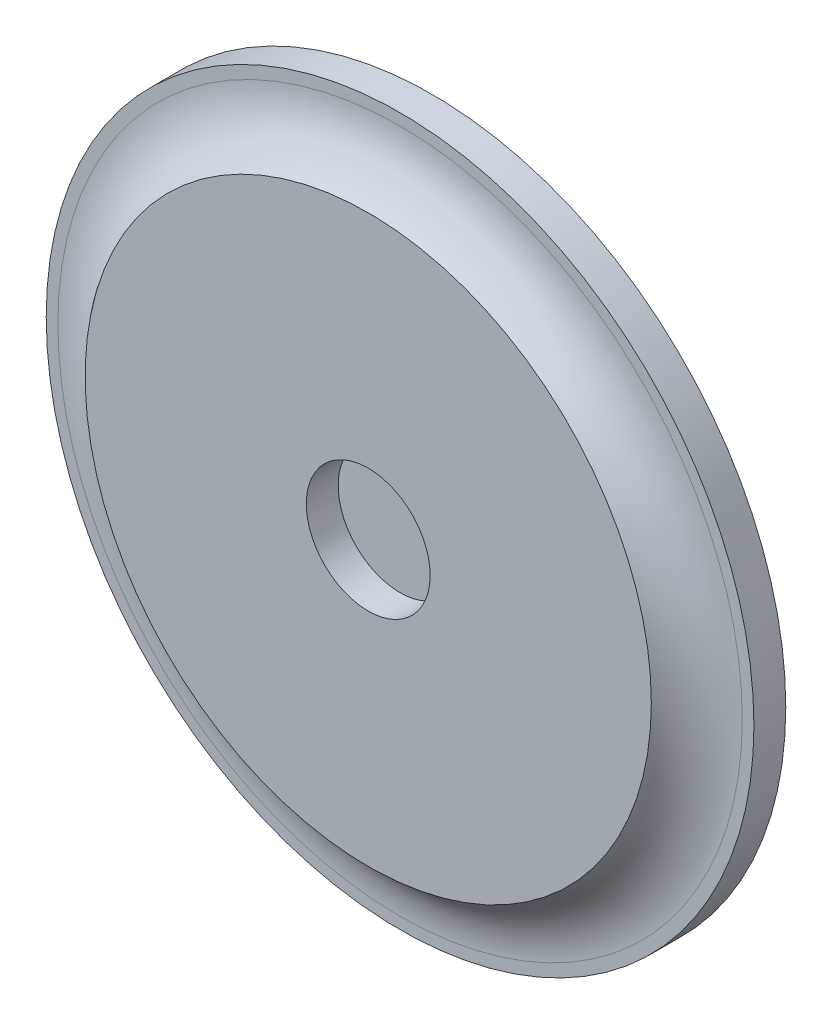
ISO-10303-21;
HEADER;
FILE_DESCRIPTION(('STEP AP214'),'2;1');
FILE_NAME('part.step','',(''),(''),'','','');
FILE_SCHEMA(('AUTOMOTIVE_DESIGN { 1 0 10303 214 1 1 1 1 }'));
ENDSEC;
DATA;
#1=APPLICATION_CONTEXT('core data for automotive mechanical design processes');
#2=APPLICATION_PROTOCOL_DEFINITION('international standard','automotive_design',2000,#1);
#3=PRODUCT_CONTEXT('',#1,'mechanical');
#4=PRODUCT('Part','Part','',(#3));
#5=PRODUCT_RELATED_PRODUCT_CATEGORY('part','',(#4));
#6=PRODUCT_DEFINITION_FORMATION('','',#4);
#7=PRODUCT_DEFINITION_CONTEXT('part definition',#1,'design');
#8=PRODUCT_DEFINITION('design','',#6,#7);
#9=PRODUCT_DEFINITION_SHAPE('','',#8);
#10=(LENGTH_UNIT() NAMED_UNIT(*) SI_UNIT(.MILLI.,.METRE.));
#11=(NAMED_UNIT(*) PLANE_ANGLE_UNIT() SI_UNIT($,.RADIAN.));
#12=(NAMED_UNIT(*) SI_UNIT($,.STERADIAN.) SOLID_ANGLE_UNIT());
#13=UNCERTAINTY_MEASURE_WITH_UNIT(LENGTH_MEASURE(1.E-05),#10,'distance_accuracy_value','');
#14=(GEOMETRIC_REPRESENTATION_CONTEXT(3) GLOBAL_UNCERTAINTY_ASSIGNED_CONTEXT((#13)) GLOBAL_UNIT_ASSIGNED_CONTEXT((#10,
#11,#12)) REPRESENTATION_CONTEXT('',''));
#15=CARTESIAN_POINT('',(0.,0.,0.));
#16=DIRECTION('',(0.,0.,1.));
#17=DIRECTION('',(1.,0.,0.));
#18=AXIS2_PLACEMENT_3D('',#15,#16,#17);
#19=CARTESIAN_POINT('',(0.,0.,1.8));
#20=DIRECTION('',(0.,0.,-1.));
#21=DIRECTION('',(-1.,0.,0.));
#22=AXIS2_PLACEMENT_3D('',#19,#20,#21);
#23=CYLINDRICAL_SURFACE('',#22,10.);
#24=CARTESIAN_POINT('',(0.,0.,0.));
#25=DIRECTION('',(0.,0.,1.));
#26=DIRECTION('',(1.,0.,0.));
#27=AXIS2_PLACEMENT_3D('',#24,#25,#26);
#28=CIRCLE('',#27,10.);
#29=CARTESIAN_POINT('',(10.,0.,0.));
#30=VERTEX_POINT('',#29);
#31=EDGE_CURVE('E51',#30,#30,#28,.T.);
#32=ORIENTED_EDGE('',*,*,#31,.T.);
#33=EDGE_LOOP('',(#32));
#34=FACE_BOUND('',#33,.T.);
#35=CARTESIAN_POINT('',(0.,0.,0.9));
#36=DIRECTION('',(0.,0.,1.));
#37=DIRECTION('',(1.,0.,0.));
#38=AXIS2_PLACEMENT_3D('',#35,#36,#37);
#39=CIRCLE('',#38,10.);
#40=CARTESIAN_POINT('',(10.,0.,0.9));
#41=VERTEX_POINT('',#40);
#42=EDGE_CURVE('E56',#41,#41,#39,.T.);
#43=ORIENTED_EDGE('',*,*,#42,.F.);
#44=EDGE_LOOP('',(#43));
#45=FACE_BOUND('',#44,.T.);
#46=ADVANCED_FACE('F43',(#34,#45),#23,.T.);
#47=CARTESIAN_POINT('',(0.,0.,0.));
#48=DIRECTION('',(0.,0.,1.));
#49=DIRECTION('',(1.,0.,0.));
#50=AXIS2_PLACEMENT_3D('',#47,#48,#49);
#51=PLANE('',#50);
#52=ORIENTED_EDGE('',*,*,#31,.F.);
#53=EDGE_LOOP('',(#52));
#54=FACE_BOUND('',#53,.T.);
#55=ADVANCED_FACE('F97',(#54),#51,.F.);
#56=CARTESIAN_POINT('',(0.,0.,0.9));
#57=DIRECTION('',(0.,0.,1.));
#58=DIRECTION('',(1.,0.,0.));
#59=AXIS2_PLACEMENT_3D('',#56,#57,#58);
#60=PLANE('',#59);
#61=CARTESIAN_POINT('',(0.,0.,0.9));
#62=DIRECTION('',(0.,0.,1.));
#63=DIRECTION('',(1.,0.,0.));
#64=AXIS2_PLACEMENT_3D('',#61,#62,#63);
#65=CIRCLE('',#64,9.67032930884901);
#66=CARTESIAN_POINT('',(9.67032930884901,0.,0.9));
#67=VERTEX_POINT('',#66);
#68=EDGE_CURVE('E10',#67,#67,#65,.F.);
#69=ORIENTED_EDGE('',*,*,#68,.T.);
#70=EDGE_LOOP('',(#69));
#71=FACE_BOUND('',#70,.T.);
#72=ORIENTED_EDGE('',*,*,#42,.T.);
#73=EDGE_LOOP('',(#72));
#74=FACE_BOUND('',#73,.T.);
#75=ADVANCED_FACE('F87',(#71,#74),#60,.T.);
#76=CARTESIAN_POINT('',(0.,0.,1.8));
#77=DIRECTION('',(0.,0.,1.));
#78=DIRECTION('',(1.,0.,0.));
#79=AXIS2_PLACEMENT_3D('',#76,#77,#78);
#80=PLANE('',#79);
#81=CARTESIAN_POINT('',(0.,0.,1.8));
#82=DIRECTION('',(0.,0.,1.));
#83=DIRECTION('',(1.,0.,0.));
#84=AXIS2_PLACEMENT_3D('',#81,#82,#83);
#85=CIRCLE('',#84,1.75);
#86=CARTESIAN_POINT('',(1.75,0.,1.8));
#87=VERTEX_POINT('',#86);
#88=EDGE_CURVE('E68',#87,#87,#85,.T.);
#89=ORIENTED_EDGE('',*,*,#88,.F.);
#90=EDGE_LOOP('',(#89));
#91=FACE_BOUND('',#90,.T.);
#92=CARTESIAN_POINT('',(0.,0.,1.8));
#93=DIRECTION('',(0.,0.,1.));
#94=DIRECTION('',(1.,0.,0.));
#95=AXIS2_PLACEMENT_3D('',#92,#93,#94);
#96=CIRCLE('',#95,8.);
#97=CARTESIAN_POINT('',(8.,0.,1.8));
#98=VERTEX_POINT('',#97);
#99=EDGE_CURVE('E61',#98,#98,#96,.T.);
#100=ORIENTED_EDGE('',*,*,#99,.T.);
#101=EDGE_LOOP('',(#100));
#102=FACE_BOUND('',#101,.T.);
#103=ADVANCED_FACE('F84',(#91,#102),#80,.T.);
#104=CARTESIAN_POINT('',(0.,0.,2.9));
#105=DIRECTION('',(0.,0.,1.));
#106=DIRECTION('',(1.,0.,0.));
#107=AXIS2_PLACEMENT_3D('',#104,#105,#106);
#108=TOROIDAL_SURFACE('',#107,9.67032930884901,2.);
#109=ORIENTED_EDGE('',*,*,#68,.F.);
#110=EDGE_LOOP('',(#109));
#111=FACE_BOUND('',#110,.T.);
#112=ORIENTED_EDGE('',*,*,#99,.F.);
#113=EDGE_LOOP('',(#112));
#114=FACE_BOUND('',#113,.T.);
#115=ADVANCED_FACE('F45',(#111,#114),#108,.F.);
#116=CARTESIAN_POINT('',(0.,0.,0.9));
#117=DIRECTION('',(0.,0.,1.));
#118=DIRECTION('',(1.,0.,0.));
#119=AXIS2_PLACEMENT_3D('',#116,#117,#118);
#120=CYLINDRICAL_SURFACE('',#119,1.75);
#121=CARTESIAN_POINT('',(0.,0.,0.9));
#122=DIRECTION('',(0.,0.,1.));
#123=DIRECTION('',(1.,0.,0.));
#124=AXIS2_PLACEMENT_3D('',#121,#122,#123);
#125=CIRCLE('',#124,1.75);
#126=CARTESIAN_POINT('',(1.75,0.,0.9));
#127=VERTEX_POINT('',#126);
#128=EDGE_CURVE('E67',#127,#127,#125,.T.);
#129=ORIENTED_EDGE('',*,*,#128,.F.);
#130=EDGE_LOOP('',(#129));
#131=FACE_BOUND('',#130,.T.);
#132=ORIENTED_EDGE('',*,*,#88,.T.);
#133=EDGE_LOOP('',(#132));
#134=FACE_BOUND('',#133,.T.);
#135=ADVANCED_FACE('F78',(#131,#134),#120,.F.);
#136=CARTESIAN_POINT('',(0.,0.,0.9));
#137=DIRECTION('',(0.,0.,1.));
#138=DIRECTION('',(1.,0.,0.));
#139=AXIS2_PLACEMENT_3D('',#136,#137,#138);
#140=PLANE('',#139);
#141=ORIENTED_EDGE('',*,*,#128,.T.);
#142=EDGE_LOOP('',(#141));
#143=FACE_BOUND('',#142,.T.);
#144=ADVANCED_FACE('F76',(#143),#140,.T.);
#145=CLOSED_SHELL('',(#46,#55,#75,#103,#115,#135,#144));
#146=MANIFOLD_SOLID_BREP('B2',#145);
#147=ADVANCED_BREP_SHAPE_REPRESENTATION('',(#18,#146),#14);
#148=SHAPE_DEFINITION_REPRESENTATION(#9,#147);
ENDSEC;
END-ISO-10303-21;
